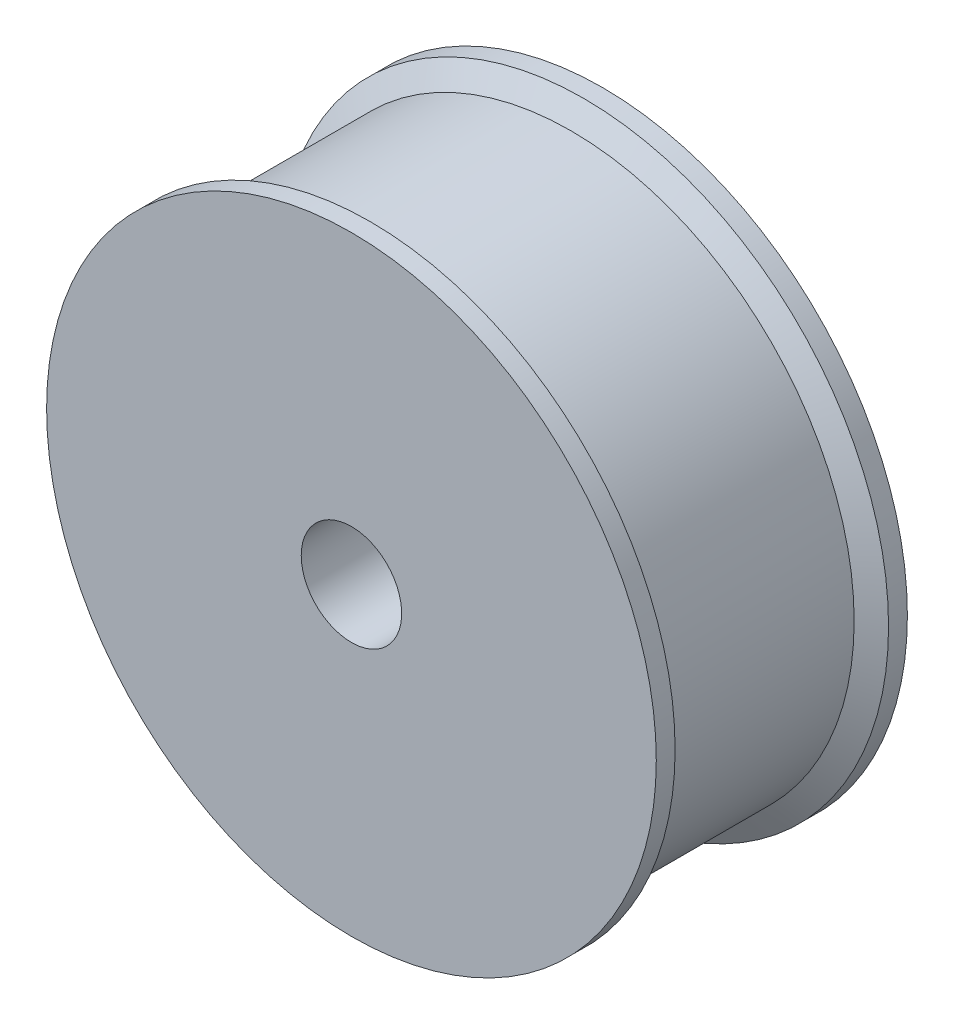
ISO-10303-21;
HEADER;
FILE_DESCRIPTION(('STEP AP214'),'2;1');
FILE_NAME('part.step','',(''),(''),'','','');
FILE_SCHEMA(('AUTOMOTIVE_DESIGN { 1 0 10303 214 1 1 1 1 }'));
ENDSEC;
DATA;
#1=APPLICATION_CONTEXT('core data for automotive mechanical design processes');
#2=APPLICATION_PROTOCOL_DEFINITION('international standard','automotive_design',2000,#1);
#3=PRODUCT_CONTEXT('',#1,'mechanical');
#4=PRODUCT('Part','Part','',(#3));
#5=PRODUCT_RELATED_PRODUCT_CATEGORY('part','',(#4));
#6=PRODUCT_DEFINITION_FORMATION('','',#4);
#7=PRODUCT_DEFINITION_CONTEXT('part definition',#1,'design');
#8=PRODUCT_DEFINITION('design','',#6,#7);
#9=PRODUCT_DEFINITION_SHAPE('','',#8);
#10=(LENGTH_UNIT() NAMED_UNIT(*) SI_UNIT(.MILLI.,.METRE.));
#11=(NAMED_UNIT(*) PLANE_ANGLE_UNIT() SI_UNIT($,.RADIAN.));
#12=(NAMED_UNIT(*) SI_UNIT($,.STERADIAN.) SOLID_ANGLE_UNIT());
#13=UNCERTAINTY_MEASURE_WITH_UNIT(LENGTH_MEASURE(1.E-05),#10,'distance_accuracy_value','');
#14=(GEOMETRIC_REPRESENTATION_CONTEXT(3) GLOBAL_UNCERTAINTY_ASSIGNED_CONTEXT((#13)) GLOBAL_UNIT_ASSIGNED_CONTEXT((#10,
#11,#12)) REPRESENTATION_CONTEXT('',''));
#15=CARTESIAN_POINT('',(0.,0.,0.));
#16=DIRECTION('',(0.,0.,1.));
#17=DIRECTION('',(1.,0.,0.));
#18=AXIS2_PLACEMENT_3D('',#15,#16,#17);
#19=CARTESIAN_POINT('',(0.,0.,27.5));
#20=DIRECTION('',(0.,0.,1.));
#21=DIRECTION('',(1.,0.,0.));
#22=AXIS2_PLACEMENT_3D('',#19,#20,#21);
#23=CONICAL_SURFACE('',#22,22.54,1.04917802969851);
#24=CARTESIAN_POINT('',(0.,0.,28.5));
#25=DIRECTION('',(0.,0.,-1.));
#26=DIRECTION('',(-1.,0.,0.));
#27=AXIS2_PLACEMENT_3D('',#24,#25,#26);
#28=CIRCLE('',#27,24.28);
#29=CARTESIAN_POINT('',(-24.28,0.,28.5));
#30=VERTEX_POINT('',#29);
#31=EDGE_CURVE('E36',#30,#30,#28,.T.);
#32=ORIENTED_EDGE('',*,*,#31,.T.);
#33=EDGE_LOOP('',(#32));
#34=FACE_BOUND('',#33,.T.);
#35=CARTESIAN_POINT('',(0.,0.,27.5));
#36=DIRECTION('',(0.,0.,-1.));
#37=DIRECTION('',(-1.,0.,0.));
#38=AXIS2_PLACEMENT_3D('',#35,#36,#37);
#39=CIRCLE('',#38,22.54);
#40=CARTESIAN_POINT('',(-22.54,0.,27.5));
#41=VERTEX_POINT('',#40);
#42=EDGE_CURVE('E61',#41,#41,#39,.T.);
#43=ORIENTED_EDGE('',*,*,#42,.F.);
#44=EDGE_LOOP('',(#43));
#45=FACE_BOUND('',#44,.T.);
#46=ADVANCED_FACE('F30',(#34,#45),#23,.T.);
#47=CARTESIAN_POINT('',(0.,0.,0.));
#48=DIRECTION('',(0.,0.,-1.));
#49=DIRECTION('',(-1.,0.,0.));
#50=AXIS2_PLACEMENT_3D('',#47,#48,#49);
#51=CYLINDRICAL_SURFACE('',#50,24.28);
#52=CARTESIAN_POINT('',(0.,0.,30.));
#53=DIRECTION('',(0.,0.,-1.));
#54=DIRECTION('',(-1.,0.,0.));
#55=AXIS2_PLACEMENT_3D('',#52,#53,#54);
#56=CIRCLE('',#55,24.28);
#57=CARTESIAN_POINT('',(-24.28,0.,30.));
#58=VERTEX_POINT('',#57);
#59=EDGE_CURVE('E40',#58,#58,#56,.T.);
#60=ORIENTED_EDGE('',*,*,#59,.T.);
#61=EDGE_LOOP('',(#60));
#62=FACE_BOUND('',#61,.T.);
#63=ORIENTED_EDGE('',*,*,#31,.F.);
#64=EDGE_LOOP('',(#63));
#65=FACE_BOUND('',#64,.T.);
#66=ADVANCED_FACE('F80',(#62,#65),#51,.T.);
#67=CARTESIAN_POINT('',(0.,24.28,30.));
#68=DIRECTION('',(0.,0.,1.));
#69=DIRECTION('',(1.,0.,0.));
#70=AXIS2_PLACEMENT_3D('',#67,#68,#69);
#71=PLANE('',#70);
#72=CARTESIAN_POINT('',(0.,0.,30.));
#73=DIRECTION('',(0.,0.,-1.));
#74=DIRECTION('',(-1.,0.,0.));
#75=AXIS2_PLACEMENT_3D('',#72,#73,#74);
#76=CIRCLE('',#75,4.);
#77=CARTESIAN_POINT('',(-4.,0.,30.));
#78=VERTEX_POINT('',#77);
#79=EDGE_CURVE('E44',#78,#78,#76,.T.);
#80=ORIENTED_EDGE('',*,*,#79,.T.);
#81=EDGE_LOOP('',(#80));
#82=FACE_BOUND('',#81,.T.);
#83=ORIENTED_EDGE('',*,*,#59,.F.);
#84=EDGE_LOOP('',(#83));
#85=FACE_BOUND('',#84,.T.);
#86=ADVANCED_FACE('F74',(#82,#85),#71,.T.);
#87=CARTESIAN_POINT('',(0.,0.,0.));
#88=DIRECTION('',(0.,0.,-1.));
#89=DIRECTION('',(-1.,0.,0.));
#90=AXIS2_PLACEMENT_3D('',#87,#88,#89);
#91=CYLINDRICAL_SURFACE('',#90,4.);
#92=CARTESIAN_POINT('',(0.,0.,8.));
#93=DIRECTION('',(0.,0.,1.));
#94=DIRECTION('',(0.,-1.,0.));
#95=AXIS2_PLACEMENT_3D('',#92,#93,#94);
#96=CIRCLE('',#95,4.);
#97=CARTESIAN_POINT('',(0.,-4.,8.));
#98=VERTEX_POINT('',#97);
#99=EDGE_CURVE('E64',#98,#98,#96,.T.);
#100=ORIENTED_EDGE('',*,*,#99,.F.);
#101=EDGE_LOOP('',(#100));
#102=FACE_BOUND('',#101,.T.);
#103=ORIENTED_EDGE('',*,*,#79,.F.);
#104=EDGE_LOOP('',(#103));
#105=FACE_BOUND('',#104,.T.);
#106=ADVANCED_FACE('F70',(#102,#105),#91,.F.);
#107=CARTESIAN_POINT('',(0.,0.,0.));
#108=DIRECTION('',(0.,0.,-1.));
#109=DIRECTION('',(-1.,0.,0.));
#110=AXIS2_PLACEMENT_3D('',#107,#108,#109);
#111=CYLINDRICAL_SURFACE('',#110,16.5);
#112=CARTESIAN_POINT('',(0.,0.,8.));
#113=DIRECTION('',(0.,0.,1.));
#114=DIRECTION('',(0.,-1.,0.));
#115=AXIS2_PLACEMENT_3D('',#112,#113,#114);
#116=CIRCLE('',#115,16.5);
#117=CARTESIAN_POINT('',(0.,-16.5,8.));
#118=VERTEX_POINT('',#117);
#119=EDGE_CURVE('E10',#118,#118,#116,.F.);
#120=ORIENTED_EDGE('',*,*,#119,.F.);
#121=EDGE_LOOP('',(#120));
#122=FACE_BOUND('',#121,.T.);
#123=CARTESIAN_POINT('',(0.,0.,10.));
#124=DIRECTION('',(0.,0.,-1.));
#125=DIRECTION('',(-1.,0.,0.));
#126=AXIS2_PLACEMENT_3D('',#123,#124,#125);
#127=CIRCLE('',#126,16.5);
#128=CARTESIAN_POINT('',(-16.5,0.,10.));
#129=VERTEX_POINT('',#128);
#130=EDGE_CURVE('E49',#129,#129,#127,.T.);
#131=ORIENTED_EDGE('',*,*,#130,.T.);
#132=EDGE_LOOP('',(#131));
#133=FACE_BOUND('',#132,.T.);
#134=ADVANCED_FACE('F73',(#122,#133),#111,.T.);
#135=CARTESIAN_POINT('',(0.,24.28,10.));
#136=DIRECTION('',(0.,0.,-1.));
#137=DIRECTION('',(-1.,0.,0.));
#138=AXIS2_PLACEMENT_3D('',#135,#136,#137);
#139=PLANE('',#138);
#140=CARTESIAN_POINT('',(0.,0.,10.));
#141=DIRECTION('',(0.,0.,-1.));
#142=DIRECTION('',(-1.,0.,0.));
#143=AXIS2_PLACEMENT_3D('',#140,#141,#142);
#144=CIRCLE('',#143,24.28);
#145=CARTESIAN_POINT('',(-24.28,0.,10.));
#146=VERTEX_POINT('',#145);
#147=EDGE_CURVE('E52',#146,#146,#144,.T.);
#148=ORIENTED_EDGE('',*,*,#147,.T.);
#149=EDGE_LOOP('',(#148));
#150=FACE_BOUND('',#149,.T.);
#151=ORIENTED_EDGE('',*,*,#130,.F.);
#152=EDGE_LOOP('',(#151));
#153=FACE_BOUND('',#152,.T.);
#154=ADVANCED_FACE('F92',(#150,#153),#139,.T.);
#155=CARTESIAN_POINT('',(0.,0.,0.));
#156=DIRECTION('',(0.,0.,-1.));
#157=DIRECTION('',(-1.,0.,0.));
#158=AXIS2_PLACEMENT_3D('',#155,#156,#157);
#159=CYLINDRICAL_SURFACE('',#158,24.28);
#160=CARTESIAN_POINT('',(0.,0.,11.5));
#161=DIRECTION('',(0.,0.,-1.));
#162=DIRECTION('',(-1.,0.,0.));
#163=AXIS2_PLACEMENT_3D('',#160,#161,#162);
#164=CIRCLE('',#163,24.28);
#165=CARTESIAN_POINT('',(-24.28,0.,11.5));
#166=VERTEX_POINT('',#165);
#167=EDGE_CURVE('E55',#166,#166,#164,.T.);
#168=ORIENTED_EDGE('',*,*,#167,.T.);
#169=EDGE_LOOP('',(#168));
#170=FACE_BOUND('',#169,.T.);
#171=ORIENTED_EDGE('',*,*,#147,.F.);
#172=EDGE_LOOP('',(#171));
#173=FACE_BOUND('',#172,.T.);
#174=ADVANCED_FACE('F96',(#170,#173),#159,.T.);
#175=CARTESIAN_POINT('',(0.,0.,11.5));
#176=DIRECTION('',(0.,0.,-1.));
#177=DIRECTION('',(-1.,0.,0.));
#178=AXIS2_PLACEMENT_3D('',#175,#176,#177);
#179=CONICAL_SURFACE('',#178,24.28,1.04917802969851);
#180=CARTESIAN_POINT('',(0.,0.,12.5));
#181=DIRECTION('',(0.,0.,-1.));
#182=DIRECTION('',(-1.,0.,0.));
#183=AXIS2_PLACEMENT_3D('',#180,#181,#182);
#184=CIRCLE('',#183,22.54);
#185=CARTESIAN_POINT('',(-22.54,0.,12.5));
#186=VERTEX_POINT('',#185);
#187=EDGE_CURVE('E58',#186,#186,#184,.T.);
#188=ORIENTED_EDGE('',*,*,#187,.T.);
#189=EDGE_LOOP('',(#188));
#190=FACE_BOUND('',#189,.T.);
#191=ORIENTED_EDGE('',*,*,#167,.F.);
#192=EDGE_LOOP('',(#191));
#193=FACE_BOUND('',#192,.T.);
#194=ADVANCED_FACE('F100',(#190,#193),#179,.T.);
#195=CARTESIAN_POINT('',(0.,0.,0.));
#196=DIRECTION('',(0.,0.,-1.));
#197=DIRECTION('',(-1.,0.,0.));
#198=AXIS2_PLACEMENT_3D('',#195,#196,#197);
#199=CYLINDRICAL_SURFACE('',#198,22.54);
#200=ORIENTED_EDGE('',*,*,#42,.T.);
#201=EDGE_LOOP('',(#200));
#202=FACE_BOUND('',#201,.T.);
#203=ORIENTED_EDGE('',*,*,#187,.F.);
#204=EDGE_LOOP('',(#203));
#205=FACE_BOUND('',#204,.T.);
#206=ADVANCED_FACE('F104',(#202,#205),#199,.T.);
#207=CARTESIAN_POINT('',(-35.,16.5,8.));
#208=DIRECTION('',(0.,0.,1.));
#209=DIRECTION('',(0.,-1.,0.));
#210=AXIS2_PLACEMENT_3D('',#207,#208,#209);
#211=PLANE('',#210);
#212=ORIENTED_EDGE('',*,*,#99,.T.);
#213=EDGE_LOOP('',(#212));
#214=FACE_BOUND('',#213,.T.);
#215=ORIENTED_EDGE('',*,*,#119,.T.);
#216=EDGE_LOOP('',(#215));
#217=FACE_BOUND('',#216,.T.);
#218=ADVANCED_FACE('F68',(#214,#217),#211,.F.);
#219=CLOSED_SHELL('',(#46,#66,#86,#106,#134,#154,#174,#194,#206,#218));
#220=MANIFOLD_SOLID_BREP('B2',#219);
#221=ADVANCED_BREP_SHAPE_REPRESENTATION('',(#18,#220),#14);
#222=SHAPE_DEFINITION_REPRESENTATION(#9,#221);
ENDSEC;
END-ISO-10303-21;
